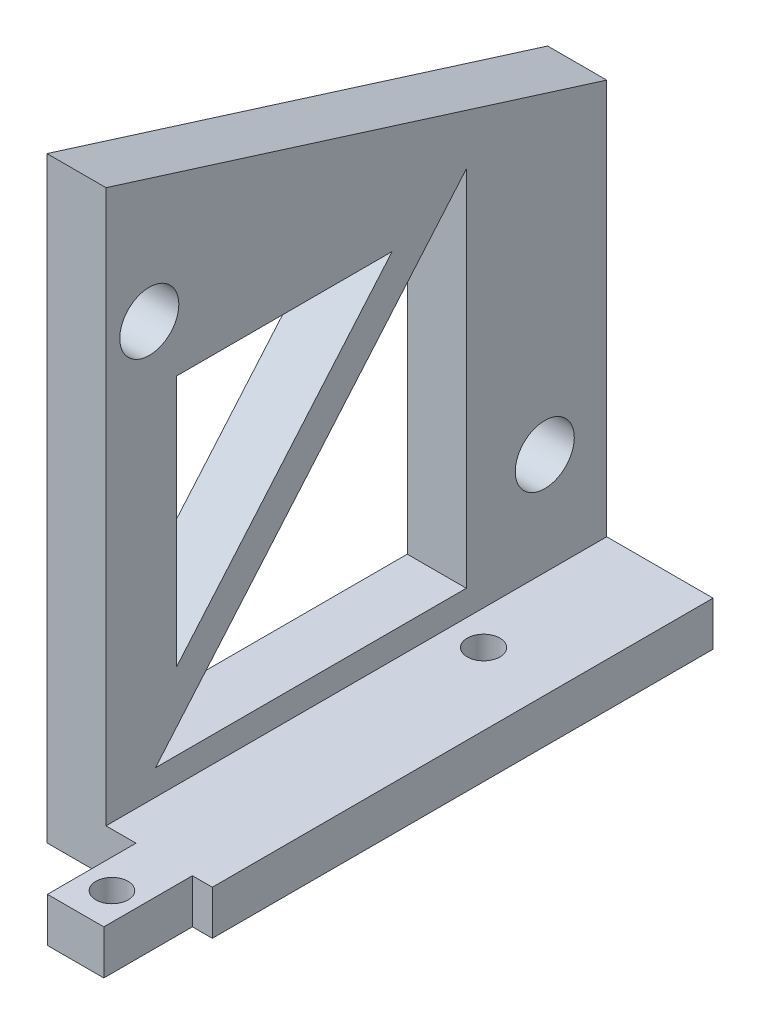
ISO-10303-21;
HEADER;
FILE_DESCRIPTION(('STEP AP214'),'2;1');
FILE_NAME('part.step','',(''),(''),'','','');
FILE_SCHEMA(('AUTOMOTIVE_DESIGN { 1 0 10303 214 1 1 1 1 }'));
ENDSEC;
DATA;
#1=APPLICATION_CONTEXT('core data for automotive mechanical design processes');
#2=APPLICATION_PROTOCOL_DEFINITION('international standard','automotive_design',2000,#1);
#3=PRODUCT_CONTEXT('',#1,'mechanical');
#4=PRODUCT('Part','Part','',(#3));
#5=PRODUCT_RELATED_PRODUCT_CATEGORY('part','',(#4));
#6=PRODUCT_DEFINITION_FORMATION('','',#4);
#7=PRODUCT_DEFINITION_CONTEXT('part definition',#1,'design');
#8=PRODUCT_DEFINITION('design','',#6,#7);
#9=PRODUCT_DEFINITION_SHAPE('','',#8);
#10=(LENGTH_UNIT() NAMED_UNIT(*) SI_UNIT(.MILLI.,.METRE.));
#11=(NAMED_UNIT(*) PLANE_ANGLE_UNIT() SI_UNIT($,.RADIAN.));
#12=(NAMED_UNIT(*) SI_UNIT($,.STERADIAN.) SOLID_ANGLE_UNIT());
#13=UNCERTAINTY_MEASURE_WITH_UNIT(LENGTH_MEASURE(1.E-05),#10,'distance_accuracy_value','');
#14=(GEOMETRIC_REPRESENTATION_CONTEXT(3) GLOBAL_UNCERTAINTY_ASSIGNED_CONTEXT((#13)) GLOBAL_UNIT_ASSIGNED_CONTEXT((#10,
#11,#12)) REPRESENTATION_CONTEXT('',''));
#15=CARTESIAN_POINT('',(0.,0.,0.));
#16=DIRECTION('',(0.,0.,1.));
#17=DIRECTION('',(1.,0.,0.));
#18=AXIS2_PLACEMENT_3D('',#15,#16,#17);
#19=CARTESIAN_POINT('',(5.08,0.,32.5746902013712));
#20=DIRECTION('',(0.,0.,1.));
#21=DIRECTION('',(1.,0.,0.));
#22=AXIS2_PLACEMENT_3D('',#19,#20,#21);
#23=PLANE('',#22);
#24=DIRECTION('',(0.,1.,0.));
#25=VECTOR('',#24,1.);
#26=CARTESIAN_POINT('',(12.5094340926282,-1.905,32.5746902013712));
#27=LINE('',#26,#25);
#28=CARTESIAN_POINT('',(12.5094340926282,-1.905,32.5746902013712));
#29=VERTEX_POINT('',#28);
#30=CARTESIAN_POINT('',(12.5094340926282,1.905,32.5746902013712));
#31=VERTEX_POINT('',#30);
#32=EDGE_CURVE('E171',#29,#31,#27,.T.);
#33=ORIENTED_EDGE('',*,*,#32,.F.);
#34=DIRECTION('',(-1.,0.,0.));
#35=VECTOR('',#34,1.);
#36=CARTESIAN_POINT('',(14.224,-1.905,32.5746902013712));
#37=LINE('',#36,#35);
#38=CARTESIAN_POINT('',(14.224,-1.905,32.5746902013712));
#39=VERTEX_POINT('',#38);
#40=EDGE_CURVE('E204',#39,#29,#37,.T.);
#41=ORIENTED_EDGE('',*,*,#40,.F.);
#42=DIRECTION('',(0.,-1.,0.));
#43=VECTOR('',#42,1.);
#44=CARTESIAN_POINT('',(14.224,0.,32.5746902013712));
#45=LINE('',#44,#43);
#46=CARTESIAN_POINT('',(14.224,1.905,32.5746902013712));
#47=VERTEX_POINT('',#46);
#48=EDGE_CURVE('E194',#47,#39,#45,.T.);
#49=ORIENTED_EDGE('',*,*,#48,.F.);
#50=DIRECTION('',(-1.,0.,0.));
#51=VECTOR('',#50,1.);
#52=CARTESIAN_POINT('',(14.224,1.905,32.5746902013712));
#53=LINE('',#52,#51);
#54=EDGE_CURVE('E62',#47,#31,#53,.T.);
#55=ORIENTED_EDGE('',*,*,#54,.T.);
#56=EDGE_LOOP('',(#33,#41,#49,#55));
#57=FACE_BOUND('',#56,.T.);
#58=ADVANCED_FACE('F37',(#57),#23,.T.);
#59=CARTESIAN_POINT('',(5.08,4.10823049147688,0.));
#60=DIRECTION('',(0.,-1.,0.));
#61=DIRECTION('',(0.,0.,-1.));
#62=AXIS2_PLACEMENT_3D('',#59,#60,#61);
#63=PLANE('',#62);
#64=DIRECTION('',(0.,0.,1.));
#65=VECTOR('',#64,1.);
#66=CARTESIAN_POINT('',(0.,4.10823049147688,0.));
#67=LINE('',#66,#65);
#68=CARTESIAN_POINT('',(0.,4.10823049147688,1.58128081827624));
#69=VERTEX_POINT('',#68);
#70=CARTESIAN_POINT('',(0.,4.10823049147688,28.3177414209247));
#71=VERTEX_POINT('',#70);
#72=EDGE_CURVE('E269',#69,#71,#67,.T.);
#73=ORIENTED_EDGE('',*,*,#72,.T.);
#74=DIRECTION('',(-1.,0.,0.));
#75=VECTOR('',#74,1.);
#76=CARTESIAN_POINT('',(5.08,4.10823049147688,28.3177414209247));
#77=LINE('',#76,#75);
#78=CARTESIAN_POINT('',(5.08,4.10823049147688,28.3177414209247));
#79=VERTEX_POINT('',#78);
#80=EDGE_CURVE('E11',#79,#71,#77,.T.);
#81=ORIENTED_EDGE('',*,*,#80,.F.);
#82=DIRECTION('',(0.,0.,1.));
#83=VECTOR('',#82,1.);
#84=CARTESIAN_POINT('',(5.08,4.10823049147688,0.));
#85=LINE('',#84,#83);
#86=CARTESIAN_POINT('',(5.08,4.10823049147688,1.58128081827624));
#87=VERTEX_POINT('',#86);
#88=EDGE_CURVE('E239',#87,#79,#85,.T.);
#89=ORIENTED_EDGE('',*,*,#88,.F.);
#90=DIRECTION('',(-1.,0.,0.));
#91=VECTOR('',#90,1.);
#92=CARTESIAN_POINT('',(5.08,4.10823049147688,1.58128081827624));
#93=LINE('',#92,#91);
#94=EDGE_CURVE('E275',#87,#69,#93,.T.);
#95=ORIENTED_EDGE('',*,*,#94,.T.);
#96=EDGE_LOOP('',(#73,#81,#89,#95));
#97=FACE_BOUND('',#96,.T.);
#98=ADVANCED_FACE('F316',(#97),#63,.F.);
#99=CARTESIAN_POINT('',(5.08,15.7257736725521,18.3753580042769));
#100=DIRECTION('',(0.,0.650206430239918,0.759757591653195));
#101=DIRECTION('',(0.,-0.759757591653195,0.650206430239918));
#102=AXIS2_PLACEMENT_3D('',#99,#100,#101);
#103=PLANE('',#102);
#104=DIRECTION('',(0.,0.759757591653195,-0.650206430239918));
#105=VECTOR('',#104,1.);
#106=CARTESIAN_POINT('',(0.,15.7257736725521,18.3753580042769));
#107=LINE('',#106,#105);
#108=CARTESIAN_POINT('',(0.,35.3494301660225,1.58128081827624));
#109=VERTEX_POINT('',#108);
#110=EDGE_CURVE('E272',#71,#109,#107,.T.);
#111=ORIENTED_EDGE('',*,*,#110,.T.);
#112=DIRECTION('',(-1.,0.,0.));
#113=VECTOR('',#112,1.);
#114=CARTESIAN_POINT('',(5.08,35.3494301660225,1.58128081827624));
#115=LINE('',#114,#113);
#116=CARTESIAN_POINT('',(5.08,35.3494301660225,1.58128081827624));
#117=VERTEX_POINT('',#116);
#118=EDGE_CURVE('E46',#117,#109,#115,.T.);
#119=ORIENTED_EDGE('',*,*,#118,.F.);
#120=DIRECTION('',(0.,0.759757591653195,-0.650206430239918));
#121=VECTOR('',#120,1.);
#122=CARTESIAN_POINT('',(5.08,15.7257736725521,18.3753580042769));
#123=LINE('',#122,#121);
#124=EDGE_CURVE('E242',#79,#117,#123,.T.);
#125=ORIENTED_EDGE('',*,*,#124,.F.);
#126=ORIENTED_EDGE('',*,*,#80,.T.);
#127=EDGE_LOOP('',(#111,#119,#125,#126));
#128=FACE_BOUND('',#127,.T.);
#129=ADVANCED_FACE('F319',(#128),#103,.F.);
#130=CARTESIAN_POINT('',(5.08,0.,-10.4973685630064));
#131=DIRECTION('',(0.,0.,-1.));
#132=DIRECTION('',(0.,1.,0.));
#133=AXIS2_PLACEMENT_3D('',#130,#131,#132);
#134=PLANE('',#133);
#135=DIRECTION('',(0.,-1.,0.));
#136=VECTOR('',#135,1.);
#137=CARTESIAN_POINT('',(0.,0.,-10.4973685630064));
#138=LINE('',#137,#136);
#139=CARTESIAN_POINT('',(0.,35.9244442650402,-10.4973685630064));
#140=VERTEX_POINT('',#139);
#141=CARTESIAN_POINT('',(0.,-1.905,-10.4973685630064));
#142=VERTEX_POINT('',#141);
#143=EDGE_CURVE('E261',#140,#142,#138,.T.);
#144=ORIENTED_EDGE('',*,*,#143,.F.);
#145=DIRECTION('',(-1.,0.,0.));
#146=VECTOR('',#145,1.);
#147=CARTESIAN_POINT('',(5.08,35.9244442650402,-10.4973685630064));
#148=LINE('',#147,#146);
#149=CARTESIAN_POINT('',(5.08,35.9244442650402,-10.4973685630064));
#150=VERTEX_POINT('',#149);
#151=EDGE_CURVE('E278',#150,#140,#148,.T.);
#152=ORIENTED_EDGE('',*,*,#151,.F.);
#153=DIRECTION('',(0.,-1.,0.));
#154=VECTOR('',#153,1.);
#155=CARTESIAN_POINT('',(5.08,0.,-10.4973685630064));
#156=LINE('',#155,#154);
#157=CARTESIAN_POINT('',(5.08,1.905,-10.4973685630064));
#158=VERTEX_POINT('',#157);
#159=EDGE_CURVE('E227',#150,#158,#156,.T.);
#160=ORIENTED_EDGE('',*,*,#159,.T.);
#161=DIRECTION('',(-1.,0.,0.));
#162=VECTOR('',#161,1.);
#163=CARTESIAN_POINT('',(14.224,1.905,-10.4973685630064));
#164=LINE('',#163,#162);
#165=CARTESIAN_POINT('',(14.224,1.905,-10.4973685630064));
#166=VERTEX_POINT('',#165);
#167=EDGE_CURVE('E208',#166,#158,#164,.T.);
#168=ORIENTED_EDGE('',*,*,#167,.F.);
#169=DIRECTION('',(0.,-1.,0.));
#170=VECTOR('',#169,1.);
#171=CARTESIAN_POINT('',(14.224,0.,-10.4973685630064));
#172=LINE('',#171,#170);
#173=CARTESIAN_POINT('',(14.224,-1.905,-10.4973685630064));
#174=VERTEX_POINT('',#173);
#175=EDGE_CURVE('E188',#166,#174,#172,.T.);
#176=ORIENTED_EDGE('',*,*,#175,.T.);
#177=DIRECTION('',(-1.,0.,0.));
#178=VECTOR('',#177,1.);
#179=CARTESIAN_POINT('',(14.224,-1.905,-10.4973685630064));
#180=LINE('',#179,#178);
#181=EDGE_CURVE('E198',#174,#142,#180,.T.);
#182=ORIENTED_EDGE('',*,*,#181,.T.);
#183=EDGE_LOOP('',(#144,#152,#160,#168,#176,#182));
#184=FACE_BOUND('',#183,.T.);
#185=ADVANCED_FACE('F349',(#184),#134,.T.);
#186=CARTESIAN_POINT('',(5.08,35.7012860072685,-11.2081912638372));
#187=DIRECTION('',(0.,0.954087025951675,-0.299529542634258));
#188=DIRECTION('',(0.,0.299529542634258,0.954087025951675));
#189=AXIS2_PLACEMENT_3D('',#186,#187,#188);
#190=PLANE('',#189);
#191=DIRECTION('',(0.,-0.299529542634258,-0.954087025951675));
#192=VECTOR('',#191,1.);
#193=CARTESIAN_POINT('',(0.,35.7012860072685,-11.2081912638372));
#194=LINE('',#193,#192);
#195=CARTESIAN_POINT('',(0.,49.4466426715652,32.5746902013712));
#196=VERTEX_POINT('',#195);
#197=EDGE_CURVE('E263',#196,#140,#194,.T.);
#198=ORIENTED_EDGE('',*,*,#197,.F.);
#199=DIRECTION('',(-1.,0.,0.));
#200=VECTOR('',#199,1.);
#201=CARTESIAN_POINT('',(5.08,49.4466426715652,32.5746902013712));
#202=LINE('',#201,#200);
#203=CARTESIAN_POINT('',(5.08,49.4466426715652,32.5746902013712));
#204=VERTEX_POINT('',#203);
#205=EDGE_CURVE('E281',#204,#196,#202,.T.);
#206=ORIENTED_EDGE('',*,*,#205,.F.);
#207=DIRECTION('',(0.,-0.299529542634258,-0.954087025951675));
#208=VECTOR('',#207,1.);
#209=CARTESIAN_POINT('',(5.08,35.7012860072685,-11.2081912638372));
#210=LINE('',#209,#208);
#211=EDGE_CURVE('E230',#204,#150,#210,.T.);
#212=ORIENTED_EDGE('',*,*,#211,.T.);
#213=ORIENTED_EDGE('',*,*,#151,.T.);
#214=EDGE_LOOP('',(#198,#206,#212,#213));
#215=FACE_BOUND('',#214,.T.);
#216=ADVANCED_FACE('F343',(#215),#190,.T.);
#217=DIRECTION('',(0.,-1.,0.));
#218=VECTOR('',#217,1.);
#219=CARTESIAN_POINT('',(7.65990330653921,1.905,32.5746902013712));
#220=LINE('',#219,#218);
#221=CARTESIAN_POINT('',(7.65990330653921,1.905,32.5746902013712));
#222=VERTEX_POINT('',#221);
#223=CARTESIAN_POINT('',(7.65990330653921,-1.905,32.5746902013712));
#224=VERTEX_POINT('',#223);
#225=EDGE_CURVE('E54',#222,#224,#220,.T.);
#226=ORIENTED_EDGE('',*,*,#225,.F.);
#227=CARTESIAN_POINT('',(5.08,1.905,32.5746902013712));
#228=VERTEX_POINT('',#227);
#229=EDGE_CURVE('E175',#222,#228,#53,.T.);
#230=ORIENTED_EDGE('',*,*,#229,.T.);
#231=DIRECTION('',(0.,1.,0.));
#232=VECTOR('',#231,1.);
#233=CARTESIAN_POINT('',(5.08,0.,32.5746902013712));
#234=LINE('',#233,#232);
#235=EDGE_CURVE('E233',#228,#204,#234,.T.);
#236=ORIENTED_EDGE('',*,*,#235,.T.);
#237=ORIENTED_EDGE('',*,*,#205,.T.);
#238=DIRECTION('',(0.,1.,0.));
#239=VECTOR('',#238,1.);
#240=CARTESIAN_POINT('',(0.,0.,32.5746902013712));
#241=LINE('',#240,#239);
#242=CARTESIAN_POINT('',(0.,-1.905,32.5746902013712));
#243=VERTEX_POINT('',#242);
#244=EDGE_CURVE('E266',#243,#196,#241,.T.);
#245=ORIENTED_EDGE('',*,*,#244,.F.);
#246=EDGE_CURVE('E203',#224,#243,#37,.T.);
#247=ORIENTED_EDGE('',*,*,#246,.F.);
#248=EDGE_LOOP('',(#226,#230,#236,#237,#245,#247));
#249=FACE_BOUND('',#248,.T.);
#250=ADVANCED_FACE('F336',(#249),#23,.T.);
#251=CARTESIAN_POINT('',(5.08,32.3819697146342,0.));
#252=DIRECTION('',(0.,-1.,0.));
#253=DIRECTION('',(0.,0.,-1.));
#254=AXIS2_PLACEMENT_3D('',#251,#252,#253);
#255=PLANE('',#254);
#256=DIRECTION('',(0.,0.,1.));
#257=VECTOR('',#256,1.);
#258=CARTESIAN_POINT('',(0.,32.3819697146342,0.));
#259=LINE('',#258,#257);
#260=CARTESIAN_POINT('',(0.,32.3819697146342,7.9629419909034));
#261=VERTEX_POINT('',#260);
#262=CARTESIAN_POINT('',(0.,32.3819697146342,26.5241879015583));
#263=VERTEX_POINT('',#262);
#264=EDGE_CURVE('E252',#261,#263,#259,.T.);
#265=ORIENTED_EDGE('',*,*,#264,.F.);
#266=DIRECTION('',(-1.,0.,0.));
#267=VECTOR('',#266,1.);
#268=CARTESIAN_POINT('',(5.08,32.3819697146342,7.9629419909034));
#269=LINE('',#268,#267);
#270=CARTESIAN_POINT('',(5.08,32.3819697146342,7.9629419909034));
#271=VERTEX_POINT('',#270);
#272=EDGE_CURVE('E41',#271,#261,#269,.T.);
#273=ORIENTED_EDGE('',*,*,#272,.F.);
#274=DIRECTION('',(0.,0.,1.));
#275=VECTOR('',#274,1.);
#276=CARTESIAN_POINT('',(5.08,32.3819697146342,0.));
#277=LINE('',#276,#275);
#278=CARTESIAN_POINT('',(5.08,32.3819697146342,26.5241879015583));
#279=VERTEX_POINT('',#278);
#280=EDGE_CURVE('E218',#271,#279,#277,.T.);
#281=ORIENTED_EDGE('',*,*,#280,.T.);
#282=DIRECTION('',(-1.,0.,0.));
#283=VECTOR('',#282,1.);
#284=CARTESIAN_POINT('',(5.08,32.3819697146342,26.5241879015583));
#285=LINE('',#284,#283);
#286=EDGE_CURVE('E246',#279,#263,#285,.T.);
#287=ORIENTED_EDGE('',*,*,#286,.T.);
#288=EDGE_LOOP('',(#265,#273,#281,#287));
#289=FACE_BOUND('',#288,.T.);
#290=ADVANCED_FACE('F294',(#289),#255,.T.);
#291=CARTESIAN_POINT('',(5.08,17.623761130085,20.5931311800837));
#292=DIRECTION('',(0.,0.650206430239918,0.759757591653195));
#293=DIRECTION('',(0.,-0.759757591653195,0.650206430239918));
#294=AXIS2_PLACEMENT_3D('',#291,#292,#293);
#295=PLANE('',#294);
#296=DIRECTION('',(0.,0.759757591653195,-0.650206430239918));
#297=VECTOR('',#296,1.);
#298=CARTESIAN_POINT('',(0.,17.623761130085,20.5931311800837));
#299=LINE('',#298,#297);
#300=CARTESIAN_POINT('',(0.,10.6934,26.5241879015583));
#301=VERTEX_POINT('',#300);
#302=EDGE_CURVE('E255',#301,#261,#299,.T.);
#303=ORIENTED_EDGE('',*,*,#302,.F.);
#304=DIRECTION('',(-1.,0.,0.));
#305=VECTOR('',#304,1.);
#306=CARTESIAN_POINT('',(5.08,10.6934,26.5241879015583));
#307=LINE('',#306,#305);
#308=CARTESIAN_POINT('',(5.08,10.6934,26.5241879015583));
#309=VERTEX_POINT('',#308);
#310=EDGE_CURVE('E284',#309,#301,#307,.T.);
#311=ORIENTED_EDGE('',*,*,#310,.F.);
#312=DIRECTION('',(0.,0.759757591653195,-0.650206430239918));
#313=VECTOR('',#312,1.);
#314=CARTESIAN_POINT('',(5.08,17.623761130085,20.5931311800837));
#315=LINE('',#314,#313);
#316=EDGE_CURVE('E221',#309,#271,#315,.T.);
#317=ORIENTED_EDGE('',*,*,#316,.T.);
#318=ORIENTED_EDGE('',*,*,#272,.T.);
#319=EDGE_LOOP('',(#303,#311,#317,#318));
#320=FACE_BOUND('',#319,.T.);
#321=ADVANCED_FACE('F290',(#320),#295,.T.);
#322=CARTESIAN_POINT('',(5.08,0.,26.5241879015583));
#323=DIRECTION('',(0.,0.,-1.));
#324=DIRECTION('',(-1.,0.,0.));
#325=AXIS2_PLACEMENT_3D('',#322,#323,#324);
#326=PLANE('',#325);
#327=DIRECTION('',(0.,-1.,0.));
#328=VECTOR('',#327,1.);
#329=CARTESIAN_POINT('',(0.,0.,26.5241879015583));
#330=LINE('',#329,#328);
#331=EDGE_CURVE('E258',#263,#301,#330,.T.);
#332=ORIENTED_EDGE('',*,*,#331,.F.);
#333=ORIENTED_EDGE('',*,*,#286,.F.);
#334=DIRECTION('',(0.,-1.,0.));
#335=VECTOR('',#334,1.);
#336=CARTESIAN_POINT('',(5.08,0.,26.5241879015583));
#337=LINE('',#336,#335);
#338=EDGE_CURVE('E224',#279,#309,#337,.T.);
#339=ORIENTED_EDGE('',*,*,#338,.T.);
#340=ORIENTED_EDGE('',*,*,#310,.T.);
#341=EDGE_LOOP('',(#332,#333,#339,#340));
#342=FACE_BOUND('',#341,.T.);
#343=ADVANCED_FACE('F298',(#342),#326,.T.);
#344=CARTESIAN_POINT('',(5.08,10.6934,-5.16635772292312));
#345=DIRECTION('',(-1.,0.,0.));
#346=DIRECTION('',(0.,0.,1.));
#347=AXIS2_PLACEMENT_3D('',#344,#345,#346);
#348=CYLINDRICAL_SURFACE('',#347,2.54);
#349=CARTESIAN_POINT('',(5.08,10.6934,-5.16635772292312));
#350=DIRECTION('',(1.,0.,0.));
#351=DIRECTION('',(0.,0.,-1.));
#352=AXIS2_PLACEMENT_3D('',#349,#350,#351);
#353=CIRCLE('',#352,2.54);
#354=CARTESIAN_POINT('',(5.08,10.6934,-7.70635772292312));
#355=VERTEX_POINT('',#354);
#356=EDGE_CURVE('E214',#355,#355,#353,.T.);
#357=ORIENTED_EDGE('',*,*,#356,.T.);
#358=EDGE_LOOP('',(#357));
#359=FACE_BOUND('',#358,.T.);
#360=CARTESIAN_POINT('',(0.,10.6934,-5.16635772292312));
#361=DIRECTION('',(1.,0.,0.));
#362=DIRECTION('',(0.,0.,-1.));
#363=AXIS2_PLACEMENT_3D('',#360,#361,#362);
#364=CIRCLE('',#363,2.54);
#365=CARTESIAN_POINT('',(0.,10.6934,-7.70635772292312));
#366=VERTEX_POINT('',#365);
#367=EDGE_CURVE('E249',#366,#366,#364,.T.);
#368=ORIENTED_EDGE('',*,*,#367,.F.);
#369=EDGE_LOOP('',(#368));
#370=FACE_BOUND('',#369,.T.);
#371=ADVANCED_FACE('F360',(#359,#370),#348,.F.);
#372=CARTESIAN_POINT('',(5.08,37.6299488029723,28.8521530424853));
#373=DIRECTION('',(-1.,0.,0.));
#374=DIRECTION('',(0.,0.,1.));
#375=AXIS2_PLACEMENT_3D('',#372,#373,#374);
#376=CYLINDRICAL_SURFACE('',#375,2.54);
#377=CARTESIAN_POINT('',(5.08,37.6299488029723,28.8521530424853));
#378=DIRECTION('',(1.,0.,0.));
#379=DIRECTION('',(0.,0.,-1.));
#380=AXIS2_PLACEMENT_3D('',#377,#378,#379);
#381=CIRCLE('',#380,2.54);
#382=CARTESIAN_POINT('',(5.08,37.6299488029723,26.3121530424853));
#383=VERTEX_POINT('',#382);
#384=EDGE_CURVE('E211',#383,#383,#381,.T.);
#385=ORIENTED_EDGE('',*,*,#384,.T.);
#386=EDGE_LOOP('',(#385));
#387=FACE_BOUND('',#386,.T.);
#388=CARTESIAN_POINT('',(0.,37.6299488029723,28.8521530424853));
#389=DIRECTION('',(1.,0.,0.));
#390=DIRECTION('',(0.,0.,-1.));
#391=AXIS2_PLACEMENT_3D('',#388,#389,#390);
#392=CIRCLE('',#391,2.54);
#393=CARTESIAN_POINT('',(0.,37.6299488029723,26.3121530424853));
#394=VERTEX_POINT('',#393);
#395=EDGE_CURVE('E210',#394,#394,#392,.T.);
#396=ORIENTED_EDGE('',*,*,#395,.F.);
#397=EDGE_LOOP('',(#396));
#398=FACE_BOUND('',#397,.T.);
#399=ADVANCED_FACE('F39',(#387,#398),#376,.F.);
#400=CARTESIAN_POINT('',(5.08,0.,1.58128081827624));
#401=DIRECTION('',(0.,0.,-1.));
#402=DIRECTION('',(-1.,0.,0.));
#403=AXIS2_PLACEMENT_3D('',#400,#401,#402);
#404=PLANE('',#403);
#405=DIRECTION('',(0.,-1.,0.));
#406=VECTOR('',#405,1.);
#407=CARTESIAN_POINT('',(0.,0.,1.58128081827624));
#408=LINE('',#407,#406);
#409=EDGE_CURVE('E215',#109,#69,#408,.T.);
#410=ORIENTED_EDGE('',*,*,#409,.T.);
#411=ORIENTED_EDGE('',*,*,#94,.F.);
#412=DIRECTION('',(0.,-1.,0.));
#413=VECTOR('',#412,1.);
#414=CARTESIAN_POINT('',(5.08,0.,1.58128081827624));
#415=LINE('',#414,#413);
#416=EDGE_CURVE('E244',#117,#87,#415,.T.);
#417=ORIENTED_EDGE('',*,*,#416,.F.);
#418=ORIENTED_EDGE('',*,*,#118,.T.);
#419=EDGE_LOOP('',(#410,#411,#417,#418));
#420=FACE_BOUND('',#419,.T.);
#421=ADVANCED_FACE('F304',(#420),#404,.F.);
#422=CARTESIAN_POINT('',(5.08,0.,0.));
#423=DIRECTION('',(1.,0.,0.));
#424=DIRECTION('',(0.,0.,-1.));
#425=AXIS2_PLACEMENT_3D('',#422,#423,#424);
#426=PLANE('',#425);
#427=ORIENTED_EDGE('',*,*,#384,.F.);
#428=EDGE_LOOP('',(#427));
#429=FACE_BOUND('',#428,.T.);
#430=ORIENTED_EDGE('',*,*,#356,.F.);
#431=EDGE_LOOP('',(#430));
#432=FACE_BOUND('',#431,.T.);
#433=ORIENTED_EDGE('',*,*,#280,.F.);
#434=ORIENTED_EDGE('',*,*,#316,.F.);
#435=ORIENTED_EDGE('',*,*,#338,.F.);
#436=EDGE_LOOP('',(#433,#434,#435));
#437=FACE_BOUND('',#436,.T.);
#438=ORIENTED_EDGE('',*,*,#159,.F.);
#439=ORIENTED_EDGE('',*,*,#211,.F.);
#440=ORIENTED_EDGE('',*,*,#235,.F.);
#441=DIRECTION('',(0.,0.,-1.));
#442=VECTOR('',#441,1.);
#443=CARTESIAN_POINT('',(5.08,1.905,0.));
#444=LINE('',#443,#442);
#445=EDGE_CURVE('E236',#228,#158,#444,.T.);
#446=ORIENTED_EDGE('',*,*,#445,.T.);
#447=EDGE_LOOP('',(#438,#439,#440,#446));
#448=FACE_BOUND('',#447,.T.);
#449=ORIENTED_EDGE('',*,*,#88,.T.);
#450=ORIENTED_EDGE('',*,*,#124,.T.);
#451=ORIENTED_EDGE('',*,*,#416,.T.);
#452=EDGE_LOOP('',(#449,#450,#451));
#453=FACE_BOUND('',#452,.T.);
#454=ADVANCED_FACE('F301',(#429,#432,#437,#448,#453),#426,.T.);
#455=CARTESIAN_POINT('',(0.,0.,0.));
#456=DIRECTION('',(1.,0.,0.));
#457=DIRECTION('',(0.,0.,-1.));
#458=AXIS2_PLACEMENT_3D('',#455,#456,#457);
#459=PLANE('',#458);
#460=ORIENTED_EDGE('',*,*,#395,.T.);
#461=EDGE_LOOP('',(#460));
#462=FACE_BOUND('',#461,.T.);
#463=ORIENTED_EDGE('',*,*,#367,.T.);
#464=EDGE_LOOP('',(#463));
#465=FACE_BOUND('',#464,.T.);
#466=ORIENTED_EDGE('',*,*,#264,.T.);
#467=ORIENTED_EDGE('',*,*,#331,.T.);
#468=ORIENTED_EDGE('',*,*,#302,.T.);
#469=EDGE_LOOP('',(#466,#467,#468));
#470=FACE_BOUND('',#469,.T.);
#471=ORIENTED_EDGE('',*,*,#143,.T.);
#472=DIRECTION('',(0.,0.,-1.));
#473=VECTOR('',#472,1.);
#474=CARTESIAN_POINT('',(0.,-1.905,0.));
#475=LINE('',#474,#473);
#476=EDGE_CURVE('E186',#243,#142,#475,.T.);
#477=ORIENTED_EDGE('',*,*,#476,.F.);
#478=ORIENTED_EDGE('',*,*,#244,.T.);
#479=ORIENTED_EDGE('',*,*,#197,.T.);
#480=EDGE_LOOP('',(#471,#477,#478,#479));
#481=FACE_BOUND('',#480,.T.);
#482=ORIENTED_EDGE('',*,*,#72,.F.);
#483=ORIENTED_EDGE('',*,*,#409,.F.);
#484=ORIENTED_EDGE('',*,*,#110,.F.);
#485=EDGE_LOOP('',(#482,#483,#484));
#486=FACE_BOUND('',#485,.T.);
#487=ADVANCED_FACE('F296',(#462,#465,#470,#481,#486),#459,.F.);
#488=CARTESIAN_POINT('',(14.224,1.905,0.));
#489=DIRECTION('',(0.,1.,0.));
#490=DIRECTION('',(0.,0.,1.));
#491=AXIS2_PLACEMENT_3D('',#488,#489,#490);
#492=PLANE('',#491);
#493=CARTESIAN_POINT('',(10.158864625858,1.905,37.1430017491195));
#494=DIRECTION('',(0.,1.,0.));
#495=DIRECTION('',(0.,0.,1.));
#496=AXIS2_PLACEMENT_3D('',#493,#494,#495);
#497=CIRCLE('',#496,1.38768984014366);
#498=CARTESIAN_POINT('',(10.158864625858,1.905,38.5306915892632));
#499=VERTEX_POINT('',#498);
#500=EDGE_CURVE('E497',#499,#499,#497,.T.);
#501=ORIENTED_EDGE('',*,*,#500,.F.);
#502=EDGE_LOOP('',(#501));
#503=FACE_BOUND('',#502,.T.);
#504=CARTESIAN_POINT('',(8.03483941134848,1.905,3.04906193987591));
#505=DIRECTION('',(0.,1.,0.));
#506=DIRECTION('',(0.,0.,1.));
#507=AXIS2_PLACEMENT_3D('',#504,#505,#506);
#508=CIRCLE('',#507,1.40634392046857);
#509=CARTESIAN_POINT('',(8.03483941134848,1.905,4.45540586034448));
#510=VERTEX_POINT('',#509);
#511=EDGE_CURVE('E176',#510,#510,#508,.T.);
#512=ORIENTED_EDGE('',*,*,#511,.F.);
#513=EDGE_LOOP('',(#512));
#514=FACE_BOUND('',#513,.T.);
#515=ORIENTED_EDGE('',*,*,#445,.F.);
#516=ORIENTED_EDGE('',*,*,#229,.F.);
#517=DIRECTION('',(0.,0.,-1.));
#518=VECTOR('',#517,1.);
#519=CARTESIAN_POINT('',(7.65990330653921,1.905,40.1946902013712));
#520=LINE('',#519,#518);
#521=CARTESIAN_POINT('',(7.65990330653921,1.905,40.1946902013712));
#522=VERTEX_POINT('',#521);
#523=EDGE_CURVE('E156',#522,#222,#520,.T.);
#524=ORIENTED_EDGE('',*,*,#523,.F.);
#525=DIRECTION('',(-1.,0.,0.));
#526=VECTOR('',#525,1.);
#527=CARTESIAN_POINT('',(12.5094340926282,1.905,40.1946902013712));
#528=LINE('',#527,#526);
#529=CARTESIAN_POINT('',(12.5094340926282,1.905,40.1946902013712));
#530=VERTEX_POINT('',#529);
#531=EDGE_CURVE('E162',#530,#522,#528,.T.);
#532=ORIENTED_EDGE('',*,*,#531,.F.);
#533=DIRECTION('',(0.,0.,-1.));
#534=VECTOR('',#533,1.);
#535=CARTESIAN_POINT('',(12.5094340926282,1.905,40.1946902013712));
#536=LINE('',#535,#534);
#537=EDGE_CURVE('E503',#530,#31,#536,.T.);
#538=ORIENTED_EDGE('',*,*,#537,.T.);
#539=ORIENTED_EDGE('',*,*,#54,.F.);
#540=DIRECTION('',(0.,0.,-1.));
#541=VECTOR('',#540,1.);
#542=CARTESIAN_POINT('',(14.224,1.905,0.));
#543=LINE('',#542,#541);
#544=EDGE_CURVE('E191',#47,#166,#543,.T.);
#545=ORIENTED_EDGE('',*,*,#544,.T.);
#546=ORIENTED_EDGE('',*,*,#167,.T.);
#547=EDGE_LOOP('',(#515,#516,#524,#532,#538,#539,#545,#546));
#548=FACE_BOUND('',#547,.T.);
#549=ADVANCED_FACE('F174',(#503,#514,#548),#492,.T.);
#550=CARTESIAN_POINT('',(14.224,-1.905,0.));
#551=DIRECTION('',(0.,1.,0.));
#552=DIRECTION('',(0.,0.,1.));
#553=AXIS2_PLACEMENT_3D('',#550,#551,#552);
#554=PLANE('',#553);
#555=CARTESIAN_POINT('',(10.158864625858,-1.905,37.1430017491195));
#556=DIRECTION('',(0.,1.,0.));
#557=DIRECTION('',(0.,0.,1.));
#558=AXIS2_PLACEMENT_3D('',#555,#556,#557);
#559=CIRCLE('',#558,1.38768984014366);
#560=CARTESIAN_POINT('',(10.158864625858,-1.905,38.5306915892632));
#561=VERTEX_POINT('',#560);
#562=EDGE_CURVE('E494',#561,#561,#559,.T.);
#563=ORIENTED_EDGE('',*,*,#562,.T.);
#564=EDGE_LOOP('',(#563));
#565=FACE_BOUND('',#564,.T.);
#566=CARTESIAN_POINT('',(8.03483941134848,-1.905,3.04906193987591));
#567=DIRECTION('',(0.,1.,0.));
#568=DIRECTION('',(0.,0.,1.));
#569=AXIS2_PLACEMENT_3D('',#566,#567,#568);
#570=CIRCLE('',#569,1.40634392046857);
#571=CARTESIAN_POINT('',(8.03483941134848,-1.905,4.45540586034448));
#572=VERTEX_POINT('',#571);
#573=EDGE_CURVE('E179',#572,#572,#570,.T.);
#574=ORIENTED_EDGE('',*,*,#573,.T.);
#575=EDGE_LOOP('',(#574));
#576=FACE_BOUND('',#575,.T.);
#577=ORIENTED_EDGE('',*,*,#476,.T.);
#578=ORIENTED_EDGE('',*,*,#181,.F.);
#579=DIRECTION('',(0.,0.,-1.));
#580=VECTOR('',#579,1.);
#581=CARTESIAN_POINT('',(14.224,-1.905,0.));
#582=LINE('',#581,#580);
#583=EDGE_CURVE('E196',#39,#174,#582,.T.);
#584=ORIENTED_EDGE('',*,*,#583,.F.);
#585=ORIENTED_EDGE('',*,*,#40,.T.);
#586=DIRECTION('',(0.,0.,-1.));
#587=VECTOR('',#586,1.);
#588=CARTESIAN_POINT('',(12.5094340926282,-1.905,40.1946902013712));
#589=LINE('',#588,#587);
#590=CARTESIAN_POINT('',(12.5094340926282,-1.905,40.1946902013712));
#591=VERTEX_POINT('',#590);
#592=EDGE_CURVE('E181',#591,#29,#589,.T.);
#593=ORIENTED_EDGE('',*,*,#592,.F.);
#594=DIRECTION('',(1.,0.,0.));
#595=VECTOR('',#594,1.);
#596=CARTESIAN_POINT('',(7.65990330653921,-1.905,40.1946902013712));
#597=LINE('',#596,#595);
#598=CARTESIAN_POINT('',(7.65990330653921,-1.905,40.1946902013712));
#599=VERTEX_POINT('',#598);
#600=EDGE_CURVE('E161',#599,#591,#597,.T.);
#601=ORIENTED_EDGE('',*,*,#600,.F.);
#602=DIRECTION('',(0.,0.,-1.));
#603=VECTOR('',#602,1.);
#604=CARTESIAN_POINT('',(7.65990330653921,-1.905,40.1946902013712));
#605=LINE('',#604,#603);
#606=EDGE_CURVE('E158',#599,#224,#605,.T.);
#607=ORIENTED_EDGE('',*,*,#606,.T.);
#608=ORIENTED_EDGE('',*,*,#246,.T.);
#609=EDGE_LOOP('',(#577,#578,#584,#585,#593,#601,#607,#608));
#610=FACE_BOUND('',#609,.T.);
#611=ADVANCED_FACE('F329',(#565,#576,#610),#554,.F.);
#612=CARTESIAN_POINT('',(14.224,0.,0.));
#613=DIRECTION('',(1.,0.,0.));
#614=DIRECTION('',(0.,0.,-1.));
#615=AXIS2_PLACEMENT_3D('',#612,#613,#614);
#616=PLANE('',#615);
#617=ORIENTED_EDGE('',*,*,#175,.F.);
#618=ORIENTED_EDGE('',*,*,#544,.F.);
#619=ORIENTED_EDGE('',*,*,#48,.T.);
#620=ORIENTED_EDGE('',*,*,#583,.T.);
#621=EDGE_LOOP('',(#617,#618,#619,#620));
#622=FACE_BOUND('',#621,.T.);
#623=ADVANCED_FACE('F411',(#622),#616,.T.);
#624=CARTESIAN_POINT('',(8.03483941134848,-1.905,3.04906193987591));
#625=DIRECTION('',(0.,1.,0.));
#626=DIRECTION('',(0.,0.,1.));
#627=AXIS2_PLACEMENT_3D('',#624,#625,#626);
#628=CYLINDRICAL_SURFACE('',#627,1.40634392046857);
#629=CARTESIAN_POINT('',(8.03483941134848,-1.905,4.45540586034448));
#630=CARTESIAN_POINT('',(8.03483941134848,-1.8653125,4.45540586034448));
#631=CARTESIAN_POINT('',(8.03483941134848,-1.825625,4.45540586034448));
#632=CARTESIAN_POINT('',(8.03483941134848,-1.74625,4.45540586034448));
#633=CARTESIAN_POINT('',(8.03483941134848,-1.7065625,4.45540586034448));
#634=CARTESIAN_POINT('',(8.03483941134848,-1.6271875,4.45540586034448));
#635=CARTESIAN_POINT('',(8.03483941134848,-1.5875,4.45540586034448));
#636=CARTESIAN_POINT('',(8.03483941134848,-1.508125,4.45540586034448));
#637=CARTESIAN_POINT('',(8.03483941134848,-1.4684375,4.45540586034448));
#638=CARTESIAN_POINT('',(8.03483941134848,-1.3890625,4.45540586034448));
#639=CARTESIAN_POINT('',(8.03483941134848,-1.349375,4.45540586034448));
#640=CARTESIAN_POINT('',(8.03483941134848,-1.27,4.45540586034448));
#641=CARTESIAN_POINT('',(8.03483941134848,-1.2303125,4.45540586034448));
#642=CARTESIAN_POINT('',(8.03483941134848,-1.1509375,4.45540586034448));
#643=CARTESIAN_POINT('',(8.03483941134848,-1.11125,4.45540586034448));
#644=CARTESIAN_POINT('',(8.03483941134848,-1.031875,4.45540586034448));
#645=CARTESIAN_POINT('',(8.03483941134848,-0.9921875,4.45540586034448));
#646=CARTESIAN_POINT('',(8.03483941134848,-0.9128125,4.45540586034448));
#647=CARTESIAN_POINT('',(8.03483941134848,-0.873125,4.45540586034448));
#648=CARTESIAN_POINT('',(8.03483941134848,-0.79375,4.45540586034448));
#649=CARTESIAN_POINT('',(8.03483941134848,-0.7540625,4.45540586034448));
#650=CARTESIAN_POINT('',(8.03483941134848,-0.6746875,4.45540586034448));
#651=CARTESIAN_POINT('',(8.03483941134848,-0.635,4.45540586034448));
#652=CARTESIAN_POINT('',(8.03483941134848,-0.555625,4.45540586034448));
#653=CARTESIAN_POINT('',(8.03483941134848,-0.5159375,4.45540586034448));
#654=CARTESIAN_POINT('',(8.03483941134848,-0.4365625,4.45540586034448));
#655=CARTESIAN_POINT('',(8.03483941134848,-0.396875,4.45540586034448));
#656=CARTESIAN_POINT('',(8.03483941134848,-0.3175,4.45540586034448));
#657=CARTESIAN_POINT('',(8.03483941134848,-0.2778125,4.45540586034448));
#658=CARTESIAN_POINT('',(8.03483941134848,-0.1984375,4.45540586034448));
#659=CARTESIAN_POINT('',(8.03483941134848,-0.15875,4.45540586034448));
#660=CARTESIAN_POINT('',(8.03483941134848,-0.0793750000000002,4.45540586034448));
#661=CARTESIAN_POINT('',(8.03483941134848,-0.0396875000000002,4.45540586034448));
#662=CARTESIAN_POINT('',(8.03483941134848,0.0396874999999997,4.45540586034448));
#663=CARTESIAN_POINT('',(8.03483941134848,0.0793749999999997,4.45540586034448));
#664=CARTESIAN_POINT('',(8.03483941134848,0.15875,4.45540586034448));
#665=CARTESIAN_POINT('',(8.03483941134848,0.1984375,4.45540586034448));
#666=CARTESIAN_POINT('',(8.03483941134848,0.2778125,4.45540586034448));
#667=CARTESIAN_POINT('',(8.03483941134848,0.3175,4.45540586034448));
#668=CARTESIAN_POINT('',(8.03483941134848,0.396875,4.45540586034448));
#669=CARTESIAN_POINT('',(8.03483941134848,0.4365625,4.45540586034448));
#670=CARTESIAN_POINT('',(8.03483941134848,0.5159375,4.45540586034448));
#671=CARTESIAN_POINT('',(8.03483941134848,0.555625,4.45540586034448));
#672=CARTESIAN_POINT('',(8.03483941134848,0.635,4.45540586034448));
#673=CARTESIAN_POINT('',(8.03483941134848,0.6746875,4.45540586034448));
#674=CARTESIAN_POINT('',(8.03483941134848,0.7540625,4.45540586034448));
#675=CARTESIAN_POINT('',(8.03483941134848,0.79375,4.45540586034448));
#676=CARTESIAN_POINT('',(8.03483941134848,0.873125,4.45540586034448));
#677=CARTESIAN_POINT('',(8.03483941134848,0.9128125,4.45540586034448));
#678=CARTESIAN_POINT('',(8.03483941134848,0.9921875,4.45540586034448));
#679=CARTESIAN_POINT('',(8.03483941134848,1.031875,4.45540586034448));
#680=CARTESIAN_POINT('',(8.03483941134848,1.11125,4.45540586034448));
#681=CARTESIAN_POINT('',(8.03483941134848,1.1509375,4.45540586034448));
#682=CARTESIAN_POINT('',(8.03483941134848,1.2303125,4.45540586034448));
#683=CARTESIAN_POINT('',(8.03483941134848,1.27,4.45540586034448));
#684=CARTESIAN_POINT('',(8.03483941134848,1.349375,4.45540586034448));
#685=CARTESIAN_POINT('',(8.03483941134848,1.3890625,4.45540586034448));
#686=CARTESIAN_POINT('',(8.03483941134848,1.4684375,4.45540586034448));
#687=CARTESIAN_POINT('',(8.03483941134848,1.508125,4.45540586034448));
#688=CARTESIAN_POINT('',(8.03483941134848,1.5875,4.45540586034448));
#689=CARTESIAN_POINT('',(8.03483941134848,1.6271875,4.45540586034448));
#690=CARTESIAN_POINT('',(8.03483941134848,1.7065625,4.45540586034448));
#691=CARTESIAN_POINT('',(8.03483941134848,1.74625,4.45540586034448));
#692=CARTESIAN_POINT('',(8.03483941134848,1.825625,4.45540586034448));
#693=CARTESIAN_POINT('',(8.03483941134848,1.8653125,4.45540586034448));
#694=CARTESIAN_POINT('',(8.03483941134848,1.905,4.45540586034448));
#695=B_SPLINE_CURVE_WITH_KNOTS('',3,(#629,#630,#631,#632,#633,#634,#635,#636,#637,#638,#639,
#640,#641,#642,#643,#644,#645,#646,#647,#648,#649,#650,#651,#652,#653,#654,#655,#656,#657,#658,
#659,#660,#661,#662,#663,#664,#665,#666,#667,#668,#669,#670,#671,#672,#673,#674,#675,#676,#677,
#678,#679,#680,#681,#682,#683,#684,#685,#686,#687,#688,#689,#690,#691,#692,#693,#694),
.UNSPECIFIED.,.F.,.F.,(4,2,2,2,2,2,2,2,2,2,2,2,2,2,2,2,2,2,2,2,2,2,2,2,2,2,2,2,2,2,2,2,4),(0.,
0.1190625,0.238125,0.3571875,0.47625,0.5953125,0.714375,0.8334375,0.9525,1.0715625,1.190625,
1.3096875,1.42875,1.5478125,1.666875,1.7859375,1.905,2.0240625,2.143125,2.2621875,2.38125,
2.5003125,2.619375,2.7384375,2.8575,2.9765625,3.095625,3.2146875,3.33375,3.4528125,3.571875,
3.6909375,3.81),.UNSPECIFIED.);
#696=EDGE_CURVE('BSEAM416',#572,#510,#695,.T.);
#697=ORIENTED_EDGE('',*,*,#573,.F.);
#698=ORIENTED_EDGE('',*,*,#511,.T.);
#699=ORIENTED_EDGE('',*,*,#696,.T.);
#700=ORIENTED_EDGE('',*,*,#696,.F.);
#701=EDGE_LOOP('',(#697,#699,#698,#700));
#702=FACE_BOUND('',#701,.T.);
#703=ADVANCED_FACE('F416',(#702),#628,.F.);
#704=CARTESIAN_POINT('',(7.65990330653921,1.905,40.1946902013712));
#705=DIRECTION('',(1.,0.,0.));
#706=DIRECTION('',(0.,0.,-1.));
#707=AXIS2_PLACEMENT_3D('',#704,#705,#706);
#708=PLANE('',#707);
#709=ORIENTED_EDGE('',*,*,#225,.T.);
#710=ORIENTED_EDGE('',*,*,#606,.F.);
#711=DIRECTION('',(0.,-1.,0.));
#712=VECTOR('',#711,1.);
#713=CARTESIAN_POINT('',(7.65990330653921,1.905,40.1946902013712));
#714=LINE('',#713,#712);
#715=EDGE_CURVE('E152',#522,#599,#714,.T.);
#716=ORIENTED_EDGE('',*,*,#715,.F.);
#717=ORIENTED_EDGE('',*,*,#523,.T.);
#718=EDGE_LOOP('',(#709,#710,#716,#717));
#719=FACE_BOUND('',#718,.T.);
#720=ADVANCED_FACE('F154',(#719),#708,.F.);
#721=CARTESIAN_POINT('',(12.5094340926282,-1.905,40.1946902013712));
#722=DIRECTION('',(-1.,0.,0.));
#723=DIRECTION('',(0.,0.,1.));
#724=AXIS2_PLACEMENT_3D('',#721,#722,#723);
#725=PLANE('',#724);
#726=ORIENTED_EDGE('',*,*,#32,.T.);
#727=ORIENTED_EDGE('',*,*,#537,.F.);
#728=DIRECTION('',(0.,1.,0.));
#729=VECTOR('',#728,1.);
#730=CARTESIAN_POINT('',(12.5094340926282,-1.905,40.1946902013712));
#731=LINE('',#730,#729);
#732=EDGE_CURVE('E167',#591,#530,#731,.T.);
#733=ORIENTED_EDGE('',*,*,#732,.F.);
#734=ORIENTED_EDGE('',*,*,#592,.T.);
#735=EDGE_LOOP('',(#726,#727,#733,#734));
#736=FACE_BOUND('',#735,.T.);
#737=ADVANCED_FACE('F447',(#736),#725,.F.);
#738=CARTESIAN_POINT('',(0.,0.,40.1946902013712));
#739=DIRECTION('',(0.,0.,1.));
#740=DIRECTION('',(1.,0.,0.));
#741=AXIS2_PLACEMENT_3D('',#738,#739,#740);
#742=PLANE('',#741);
#743=ORIENTED_EDGE('',*,*,#531,.T.);
#744=ORIENTED_EDGE('',*,*,#715,.T.);
#745=ORIENTED_EDGE('',*,*,#600,.T.);
#746=ORIENTED_EDGE('',*,*,#732,.T.);
#747=EDGE_LOOP('',(#743,#744,#745,#746));
#748=FACE_BOUND('',#747,.T.);
#749=ADVANCED_FACE('F165',(#748),#742,.T.);
#750=CARTESIAN_POINT('',(10.158864625858,-1.905,37.1430017491195));
#751=DIRECTION('',(0.,1.,0.));
#752=DIRECTION('',(0.,0.,1.));
#753=AXIS2_PLACEMENT_3D('',#750,#751,#752);
#754=CYLINDRICAL_SURFACE('',#753,1.38768984014366);
#755=CARTESIAN_POINT('',(10.158864625858,-1.905,38.5306915892632));
#756=CARTESIAN_POINT('',(10.158864625858,-1.8653125,38.5306915892632));
#757=CARTESIAN_POINT('',(10.158864625858,-1.825625,38.5306915892632));
#758=CARTESIAN_POINT('',(10.158864625858,-1.74625,38.5306915892632));
#759=CARTESIAN_POINT('',(10.158864625858,-1.7065625,38.5306915892632));
#760=CARTESIAN_POINT('',(10.158864625858,-1.6271875,38.5306915892632));
#761=CARTESIAN_POINT('',(10.158864625858,-1.5875,38.5306915892632));
#762=CARTESIAN_POINT('',(10.158864625858,-1.508125,38.5306915892632));
#763=CARTESIAN_POINT('',(10.158864625858,-1.4684375,38.5306915892632));
#764=CARTESIAN_POINT('',(10.158864625858,-1.3890625,38.5306915892632));
#765=CARTESIAN_POINT('',(10.158864625858,-1.349375,38.5306915892632));
#766=CARTESIAN_POINT('',(10.158864625858,-1.27,38.5306915892632));
#767=CARTESIAN_POINT('',(10.158864625858,-1.2303125,38.5306915892632));
#768=CARTESIAN_POINT('',(10.158864625858,-1.1509375,38.5306915892632));
#769=CARTESIAN_POINT('',(10.158864625858,-1.11125,38.5306915892632));
#770=CARTESIAN_POINT('',(10.158864625858,-1.031875,38.5306915892632));
#771=CARTESIAN_POINT('',(10.158864625858,-0.9921875,38.5306915892632));
#772=CARTESIAN_POINT('',(10.158864625858,-0.9128125,38.5306915892632));
#773=CARTESIAN_POINT('',(10.158864625858,-0.873125,38.5306915892632));
#774=CARTESIAN_POINT('',(10.158864625858,-0.79375,38.5306915892632));
#775=CARTESIAN_POINT('',(10.158864625858,-0.7540625,38.5306915892632));
#776=CARTESIAN_POINT('',(10.158864625858,-0.6746875,38.5306915892632));
#777=CARTESIAN_POINT('',(10.158864625858,-0.635,38.5306915892632));
#778=CARTESIAN_POINT('',(10.158864625858,-0.555625,38.5306915892632));
#779=CARTESIAN_POINT('',(10.158864625858,-0.5159375,38.5306915892632));
#780=CARTESIAN_POINT('',(10.158864625858,-0.4365625,38.5306915892632));
#781=CARTESIAN_POINT('',(10.158864625858,-0.396875,38.5306915892632));
#782=CARTESIAN_POINT('',(10.158864625858,-0.3175,38.5306915892632));
#783=CARTESIAN_POINT('',(10.158864625858,-0.2778125,38.5306915892632));
#784=CARTESIAN_POINT('',(10.158864625858,-0.1984375,38.5306915892632));
#785=CARTESIAN_POINT('',(10.158864625858,-0.15875,38.5306915892632));
#786=CARTESIAN_POINT('',(10.158864625858,-0.079375,38.5306915892632));
#787=CARTESIAN_POINT('',(10.158864625858,-0.0396875,38.5306915892632));
#788=CARTESIAN_POINT('',(10.158864625858,0.0396874999999999,38.5306915892632));
#789=CARTESIAN_POINT('',(10.158864625858,0.0793749999999997,38.5306915892632));
#790=CARTESIAN_POINT('',(10.158864625858,0.15875,38.5306915892632));
#791=CARTESIAN_POINT('',(10.158864625858,0.1984375,38.5306915892632));
#792=CARTESIAN_POINT('',(10.158864625858,0.2778125,38.5306915892632));
#793=CARTESIAN_POINT('',(10.158864625858,0.3175,38.5306915892632));
#794=CARTESIAN_POINT('',(10.158864625858,0.396875,38.5306915892632));
#795=CARTESIAN_POINT('',(10.158864625858,0.4365625,38.5306915892632));
#796=CARTESIAN_POINT('',(10.158864625858,0.5159375,38.5306915892632));
#797=CARTESIAN_POINT('',(10.158864625858,0.555625,38.5306915892632));
#798=CARTESIAN_POINT('',(10.158864625858,0.635,38.5306915892632));
#799=CARTESIAN_POINT('',(10.158864625858,0.6746875,38.5306915892632));
#800=CARTESIAN_POINT('',(10.158864625858,0.7540625,38.5306915892632));
#801=CARTESIAN_POINT('',(10.158864625858,0.79375,38.5306915892632));
#802=CARTESIAN_POINT('',(10.158864625858,0.873125,38.5306915892632));
#803=CARTESIAN_POINT('',(10.158864625858,0.9128125,38.5306915892632));
#804=CARTESIAN_POINT('',(10.158864625858,0.9921875,38.5306915892632));
#805=CARTESIAN_POINT('',(10.158864625858,1.031875,38.5306915892632));
#806=CARTESIAN_POINT('',(10.158864625858,1.11125,38.5306915892632));
#807=CARTESIAN_POINT('',(10.158864625858,1.1509375,38.5306915892632));
#808=CARTESIAN_POINT('',(10.158864625858,1.2303125,38.5306915892632));
#809=CARTESIAN_POINT('',(10.158864625858,1.27,38.5306915892632));
#810=CARTESIAN_POINT('',(10.158864625858,1.349375,38.5306915892632));
#811=CARTESIAN_POINT('',(10.158864625858,1.3890625,38.5306915892632));
#812=CARTESIAN_POINT('',(10.158864625858,1.4684375,38.5306915892632));
#813=CARTESIAN_POINT('',(10.158864625858,1.508125,38.5306915892632));
#814=CARTESIAN_POINT('',(10.158864625858,1.5875,38.5306915892632));
#815=CARTESIAN_POINT('',(10.158864625858,1.6271875,38.5306915892632));
#816=CARTESIAN_POINT('',(10.158864625858,1.7065625,38.5306915892632));
#817=CARTESIAN_POINT('',(10.158864625858,1.74625,38.5306915892632));
#818=CARTESIAN_POINT('',(10.158864625858,1.825625,38.5306915892632));
#819=CARTESIAN_POINT('',(10.158864625858,1.8653125,38.5306915892632));
#820=CARTESIAN_POINT('',(10.158864625858,1.905,38.5306915892632));
#821=B_SPLINE_CURVE_WITH_KNOTS('',3,(#755,#756,#757,#758,#759,#760,#761,#762,#763,#764,#765,
#766,#767,#768,#769,#770,#771,#772,#773,#774,#775,#776,#777,#778,#779,#780,#781,#782,#783,#784,
#785,#786,#787,#788,#789,#790,#791,#792,#793,#794,#795,#796,#797,#798,#799,#800,#801,#802,#803,
#804,#805,#806,#807,#808,#809,#810,#811,#812,#813,#814,#815,#816,#817,#818,#819,#820),
.UNSPECIFIED.,.F.,.F.,(4,2,2,2,2,2,2,2,2,2,2,2,2,2,2,2,2,2,2,2,2,2,2,2,2,2,2,2,2,2,2,2,4),(0.,
0.1190625,0.238125,0.3571875,0.47625,0.5953125,0.714375,0.8334375,0.9525,1.0715625,1.190625,
1.3096875,1.42875,1.5478125,1.666875,1.7859375,1.905,2.0240625,2.143125,2.2621875,2.38125,
2.5003125,2.619375,2.7384375,2.8575,2.9765625,3.095625,3.2146875,3.33375,3.4528125,3.571875,
3.6909375,3.81),.UNSPECIFIED.);
#822=EDGE_CURVE('BSEAM466',#561,#499,#821,.T.);
#823=ORIENTED_EDGE('',*,*,#562,.F.);
#824=ORIENTED_EDGE('',*,*,#500,.T.);
#825=ORIENTED_EDGE('',*,*,#822,.T.);
#826=ORIENTED_EDGE('',*,*,#822,.F.);
#827=EDGE_LOOP('',(#823,#825,#824,#826));
#828=FACE_BOUND('',#827,.T.);
#829=ADVANCED_FACE('F466',(#828),#754,.F.);
#830=CLOSED_SHELL('',(#58,#98,#129,#185,#216,#250,#290,#321,#343,#371,#399,#421,#454,#487,#549,
#611,#623,#703,#720,#737,#749,#829));
#831=MANIFOLD_SOLID_BREP('B2',#830);
#832=ADVANCED_BREP_SHAPE_REPRESENTATION('',(#18,#831),#14);
#833=SHAPE_DEFINITION_REPRESENTATION(#9,#832);
ENDSEC;
END-ISO-10303-21;
